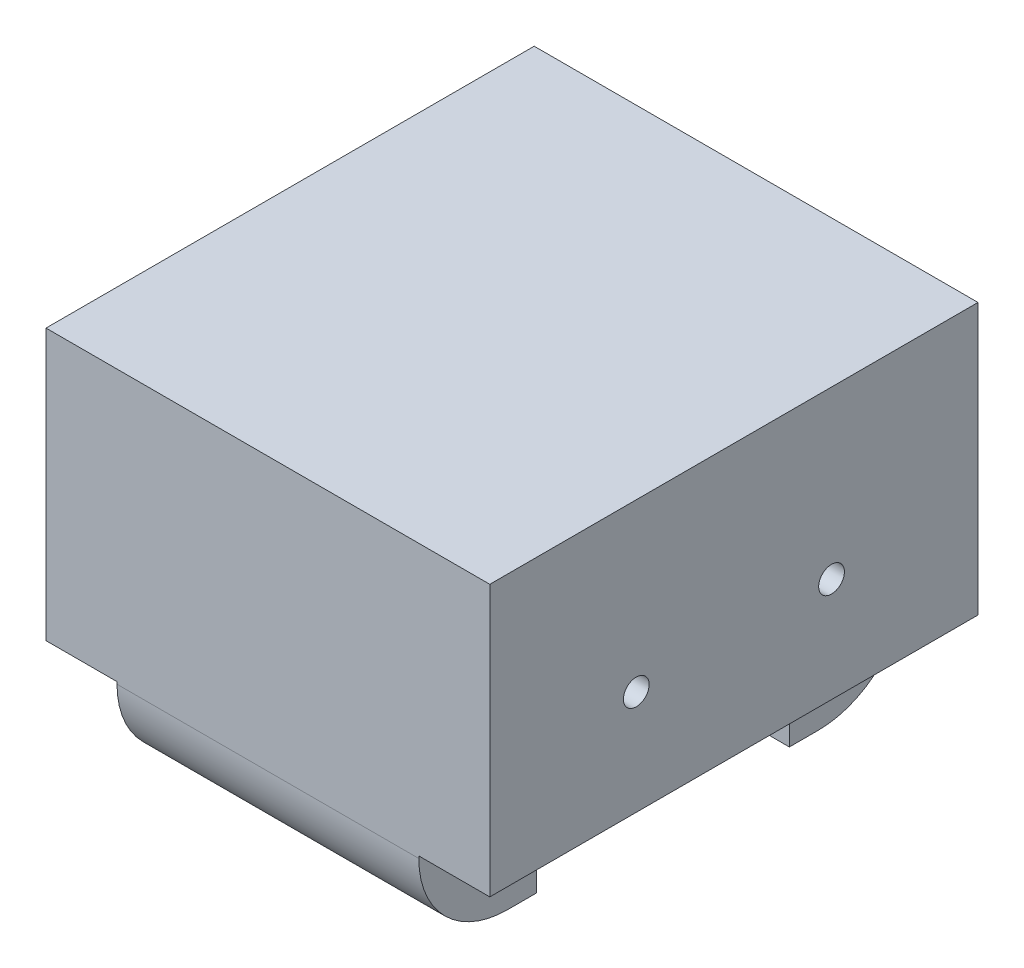
ISO-10303-21;
HEADER;
FILE_DESCRIPTION(('STEP AP214'),'2;1');
FILE_NAME('part.step','',(''),(''),'','','');
FILE_SCHEMA(('AUTOMOTIVE_DESIGN { 1 0 10303 214 1 1 1 1 }'));
ENDSEC;
DATA;
#1=APPLICATION_CONTEXT('core data for automotive mechanical design processes');
#2=APPLICATION_PROTOCOL_DEFINITION('international standard','automotive_design',2000,#1);
#3=PRODUCT_CONTEXT('',#1,'mechanical');
#4=PRODUCT('Part','Part','',(#3));
#5=PRODUCT_RELATED_PRODUCT_CATEGORY('part','',(#4));
#6=PRODUCT_DEFINITION_FORMATION('','',#4);
#7=PRODUCT_DEFINITION_CONTEXT('part definition',#1,'design');
#8=PRODUCT_DEFINITION('design','',#6,#7);
#9=PRODUCT_DEFINITION_SHAPE('','',#8);
#10=(LENGTH_UNIT() NAMED_UNIT(*) SI_UNIT(.MILLI.,.METRE.));
#11=(NAMED_UNIT(*) PLANE_ANGLE_UNIT() SI_UNIT($,.RADIAN.));
#12=(NAMED_UNIT(*) SI_UNIT($,.STERADIAN.) SOLID_ANGLE_UNIT());
#13=UNCERTAINTY_MEASURE_WITH_UNIT(LENGTH_MEASURE(1.E-05),#10,'distance_accuracy_value','');
#14=(GEOMETRIC_REPRESENTATION_CONTEXT(3) GLOBAL_UNCERTAINTY_ASSIGNED_CONTEXT((#13)) GLOBAL_UNIT_ASSIGNED_CONTEXT((#10,
#11,#12)) REPRESENTATION_CONTEXT('',''));
#15=CARTESIAN_POINT('',(0.,0.,0.));
#16=DIRECTION('',(0.,0.,1.));
#17=DIRECTION('',(1.,0.,0.));
#18=AXIS2_PLACEMENT_3D('',#15,#16,#17);
#19=CARTESIAN_POINT('',(0.,0.,-55.));
#20=DIRECTION('',(0.,0.,1.));
#21=DIRECTION('',(1.,0.,0.));
#22=AXIS2_PLACEMENT_3D('',#19,#20,#21);
#23=PLANE('',#22);
#24=DIRECTION('',(0.,-1.,0.));
#25=VECTOR('',#24,1.);
#26=CARTESIAN_POINT('',(-25.,0.,-55.));
#27=LINE('',#26,#25);
#28=CARTESIAN_POINT('',(-25.,-117.,-55.));
#29=VERTEX_POINT('',#28);
#30=CARTESIAN_POINT('',(-25.0000000000001,-147.5,-55.));
#31=VERTEX_POINT('',#30);
#32=EDGE_CURVE('E243',#29,#31,#27,.T.);
#33=ORIENTED_EDGE('',*,*,#32,.F.);
#34=DIRECTION('',(1.,0.,0.));
#35=VECTOR('',#34,1.);
#36=CARTESIAN_POINT('',(0.,-117.,-55.));
#37=LINE('',#36,#35);
#38=CARTESIAN_POINT('',(25.,-117.,-55.));
#39=VERTEX_POINT('',#38);
#40=EDGE_CURVE('E265',#29,#39,#37,.T.);
#41=ORIENTED_EDGE('',*,*,#40,.T.);
#42=DIRECTION('',(0.,1.,0.));
#43=VECTOR('',#42,1.);
#44=CARTESIAN_POINT('',(25.,0.,-55.));
#45=LINE('',#44,#43);
#46=CARTESIAN_POINT('',(25.,-147.5,-55.));
#47=VERTEX_POINT('',#46);
#48=EDGE_CURVE('E49',#47,#39,#45,.T.);
#49=ORIENTED_EDGE('',*,*,#48,.F.);
#50=DIRECTION('',(1.,0.,0.));
#51=VECTOR('',#50,1.);
#52=CARTESIAN_POINT('',(-25.0000000000001,-147.5,-55.));
#53=LINE('',#52,#51);
#54=CARTESIAN_POINT('',(17.,-147.5,-55.));
#55=VERTEX_POINT('',#54);
#56=EDGE_CURVE('E232',#55,#47,#53,.T.);
#57=ORIENTED_EDGE('',*,*,#56,.F.);
#58=DIRECTION('',(0.,-1.,0.));
#59=VECTOR('',#58,1.);
#60=CARTESIAN_POINT('',(17.,0.,-55.));
#61=LINE('',#60,#59);
#62=CARTESIAN_POINT('',(17.,-147.75,-55.));
#63=VERTEX_POINT('',#62);
#64=EDGE_CURVE('E182',#55,#63,#61,.T.);
#65=ORIENTED_EDGE('',*,*,#64,.T.);
#66=DIRECTION('',(1.,0.,0.));
#67=VECTOR('',#66,1.);
#68=CARTESIAN_POINT('',(0.,-147.75,-55.));
#69=LINE('',#68,#67);
#70=CARTESIAN_POINT('',(-17.,-147.75,-55.));
#71=VERTEX_POINT('',#70);
#72=EDGE_CURVE('E176',#63,#71,#69,.F.);
#73=ORIENTED_EDGE('',*,*,#72,.T.);
#74=DIRECTION('',(0.,1.,0.));
#75=VECTOR('',#74,1.);
#76=CARTESIAN_POINT('',(-17.,0.,-55.));
#77=LINE('',#76,#75);
#78=CARTESIAN_POINT('',(-17.,-147.5,-55.));
#79=VERTEX_POINT('',#78);
#80=EDGE_CURVE('E179',#71,#79,#77,.T.);
#81=ORIENTED_EDGE('',*,*,#80,.T.);
#82=EDGE_CURVE('E230',#31,#79,#53,.T.);
#83=ORIENTED_EDGE('',*,*,#82,.F.);
#84=EDGE_LOOP('',(#33,#41,#49,#57,#65,#73,#81,#83));
#85=FACE_BOUND('',#84,.T.);
#86=ADVANCED_FACE('F46',(#85),#23,.F.);
#87=CARTESIAN_POINT('',(0.,0.,0.));
#88=DIRECTION('',(0.,0.,1.));
#89=DIRECTION('',(1.,0.,0.));
#90=AXIS2_PLACEMENT_3D('',#87,#88,#89);
#91=PLANE('',#90);
#92=DIRECTION('',(-1.,0.,0.));
#93=VECTOR('',#92,1.);
#94=CARTESIAN_POINT('',(25.,-117.,0.));
#95=LINE('',#94,#93);
#96=CARTESIAN_POINT('',(25.,-117.,0.));
#97=VERTEX_POINT('',#96);
#98=CARTESIAN_POINT('',(-25.,-117.,0.));
#99=VERTEX_POINT('',#98);
#100=EDGE_CURVE('E71',#97,#99,#95,.T.);
#101=ORIENTED_EDGE('',*,*,#100,.T.);
#102=DIRECTION('',(0.,-1.,0.));
#103=VECTOR('',#102,1.);
#104=CARTESIAN_POINT('',(-25.,0.,0.));
#105=LINE('',#104,#103);
#106=CARTESIAN_POINT('',(-25.0000000000001,-147.5,0.));
#107=VERTEX_POINT('',#106);
#108=EDGE_CURVE('E235',#99,#107,#105,.T.);
#109=ORIENTED_EDGE('',*,*,#108,.T.);
#110=DIRECTION('',(1.,0.,0.));
#111=VECTOR('',#110,1.);
#112=CARTESIAN_POINT('',(-25.0000000000001,-147.5,0.));
#113=LINE('',#112,#111);
#114=CARTESIAN_POINT('',(-17.,-147.5,0.));
#115=VERTEX_POINT('',#114);
#116=EDGE_CURVE('E218',#107,#115,#113,.T.);
#117=ORIENTED_EDGE('',*,*,#116,.T.);
#118=DIRECTION('',(0.,1.,0.));
#119=VECTOR('',#118,1.);
#120=CARTESIAN_POINT('',(-17.,0.,0.));
#121=LINE('',#120,#119);
#122=CARTESIAN_POINT('',(-17.,-147.75,0.));
#123=VERTEX_POINT('',#122);
#124=EDGE_CURVE('E204',#123,#115,#121,.T.);
#125=ORIENTED_EDGE('',*,*,#124,.F.);
#126=DIRECTION('',(1.,0.,0.));
#127=VECTOR('',#126,1.);
#128=CARTESIAN_POINT('',(0.,-147.75,0.));
#129=LINE('',#128,#127);
#130=CARTESIAN_POINT('',(17.,-147.75,0.));
#131=VERTEX_POINT('',#130);
#132=EDGE_CURVE('E214',#123,#131,#129,.T.);
#133=ORIENTED_EDGE('',*,*,#132,.T.);
#134=DIRECTION('',(0.,-1.,0.));
#135=VECTOR('',#134,1.);
#136=CARTESIAN_POINT('',(17.,0.,0.));
#137=LINE('',#136,#135);
#138=CARTESIAN_POINT('',(17.,-147.5,0.));
#139=VERTEX_POINT('',#138);
#140=EDGE_CURVE('E213',#139,#131,#137,.T.);
#141=ORIENTED_EDGE('',*,*,#140,.F.);
#142=CARTESIAN_POINT('',(25.,-147.5,0.));
#143=VERTEX_POINT('',#142);
#144=EDGE_CURVE('E217',#139,#143,#113,.T.);
#145=ORIENTED_EDGE('',*,*,#144,.T.);
#146=DIRECTION('',(0.,1.,0.));
#147=VECTOR('',#146,1.);
#148=CARTESIAN_POINT('',(25.,0.,0.));
#149=LINE('',#148,#147);
#150=EDGE_CURVE('E295',#143,#97,#149,.T.);
#151=ORIENTED_EDGE('',*,*,#150,.T.);
#152=EDGE_LOOP('',(#101,#109,#117,#125,#133,#141,#145,#151));
#153=FACE_BOUND('',#152,.T.);
#154=ADVANCED_FACE('F301',(#153),#91,.T.);
#155=CARTESIAN_POINT('',(-25.,0.,-55.));
#156=DIRECTION('',(-1.,0.,0.));
#157=DIRECTION('',(0.,-1.,0.));
#158=AXIS2_PLACEMENT_3D('',#155,#156,#157);
#159=PLANE('',#158);
#160=DIRECTION('',(0.,0.,1.));
#161=VECTOR('',#160,1.);
#162=CARTESIAN_POINT('',(-25.,-117.,0.));
#163=LINE('',#162,#161);
#164=EDGE_CURVE('E11',#29,#99,#163,.T.);
#165=ORIENTED_EDGE('',*,*,#164,.F.);
#166=ORIENTED_EDGE('',*,*,#32,.T.);
#167=DIRECTION('',(0.,0.,1.));
#168=VECTOR('',#167,1.);
#169=CARTESIAN_POINT('',(-25.0000000000001,-147.5,0.));
#170=LINE('',#169,#168);
#171=EDGE_CURVE('E239',#31,#107,#170,.T.);
#172=ORIENTED_EDGE('',*,*,#171,.T.);
#173=ORIENTED_EDGE('',*,*,#108,.F.);
#174=EDGE_LOOP('',(#165,#166,#172,#173));
#175=FACE_BOUND('',#174,.T.);
#176=CARTESIAN_POINT('',(-25.,-135.75,-16.5));
#177=DIRECTION('',(-1.,0.,0.));
#178=DIRECTION('',(0.,-1.,0.));
#179=AXIS2_PLACEMENT_3D('',#176,#177,#178);
#180=CIRCLE('',#179,1.45);
#181=CARTESIAN_POINT('',(-25.,-137.2,-16.5));
#182=VERTEX_POINT('',#181);
#183=EDGE_CURVE('E274',#182,#182,#180,.T.);
#184=ORIENTED_EDGE('',*,*,#183,.F.);
#185=EDGE_LOOP('',(#184));
#186=FACE_BOUND('',#185,.T.);
#187=CARTESIAN_POINT('',(-25.,-135.75,-38.5));
#188=DIRECTION('',(-1.,0.,0.));
#189=DIRECTION('',(0.,-1.,0.));
#190=AXIS2_PLACEMENT_3D('',#187,#188,#189);
#191=CIRCLE('',#190,1.45);
#192=CARTESIAN_POINT('',(-25.,-137.2,-38.5));
#193=VERTEX_POINT('',#192);
#194=EDGE_CURVE('E267',#193,#193,#191,.T.);
#195=ORIENTED_EDGE('',*,*,#194,.F.);
#196=EDGE_LOOP('',(#195));
#197=FACE_BOUND('',#196,.T.);
#198=ADVANCED_FACE('F314',(#175,#186,#197),#159,.T.);
#199=CARTESIAN_POINT('',(25.,0.,-55.));
#200=DIRECTION('',(1.,0.,0.));
#201=DIRECTION('',(0.,1.,0.));
#202=AXIS2_PLACEMENT_3D('',#199,#200,#201);
#203=PLANE('',#202);
#204=DIRECTION('',(0.,0.,1.));
#205=VECTOR('',#204,1.);
#206=CARTESIAN_POINT('',(25.,-117.,0.));
#207=LINE('',#206,#205);
#208=EDGE_CURVE('E242',#39,#97,#207,.T.);
#209=ORIENTED_EDGE('',*,*,#208,.T.);
#210=ORIENTED_EDGE('',*,*,#150,.F.);
#211=DIRECTION('',(0.,0.,1.));
#212=VECTOR('',#211,1.);
#213=CARTESIAN_POINT('',(25.,-147.5,0.));
#214=LINE('',#213,#212);
#215=EDGE_CURVE('E236',#47,#143,#214,.T.);
#216=ORIENTED_EDGE('',*,*,#215,.F.);
#217=ORIENTED_EDGE('',*,*,#48,.T.);
#218=EDGE_LOOP('',(#209,#210,#216,#217));
#219=FACE_BOUND('',#218,.T.);
#220=CARTESIAN_POINT('',(25.,-135.75,-16.5));
#221=DIRECTION('',(-1.,0.,0.));
#222=DIRECTION('',(0.,-1.,0.));
#223=AXIS2_PLACEMENT_3D('',#220,#221,#222);
#224=CIRCLE('',#223,1.45);
#225=CARTESIAN_POINT('',(25.,-137.2,-16.5));
#226=VERTEX_POINT('',#225);
#227=EDGE_CURVE('E285',#226,#226,#224,.T.);
#228=ORIENTED_EDGE('',*,*,#227,.T.);
#229=EDGE_LOOP('',(#228));
#230=FACE_BOUND('',#229,.T.);
#231=CARTESIAN_POINT('',(25.,-135.75,-38.5));
#232=DIRECTION('',(-1.,0.,0.));
#233=DIRECTION('',(0.,-1.,0.));
#234=AXIS2_PLACEMENT_3D('',#231,#232,#233);
#235=CIRCLE('',#234,1.45);
#236=CARTESIAN_POINT('',(25.,-137.2,-38.5));
#237=VERTEX_POINT('',#236);
#238=EDGE_CURVE('E269',#237,#237,#235,.T.);
#239=ORIENTED_EDGE('',*,*,#238,.T.);
#240=EDGE_LOOP('',(#239));
#241=FACE_BOUND('',#240,.T.);
#242=ADVANCED_FACE('F306',(#219,#230,#241),#203,.T.);
#243=CARTESIAN_POINT('',(-25.0000000000001,-132.5,0.));
#244=DIRECTION('',(0.,1.,0.));
#245=DIRECTION('',(-1.,0.,0.));
#246=AXIS2_PLACEMENT_3D('',#243,#244,#245);
#247=PLANE('',#246);
#248=DIRECTION('',(1.,0.,0.));
#249=VECTOR('',#248,1.);
#250=CARTESIAN_POINT('',(0.,-132.5,-41.75));
#251=LINE('',#250,#249);
#252=CARTESIAN_POINT('',(-17.,-132.5,-41.75));
#253=VERTEX_POINT('',#252);
#254=CARTESIAN_POINT('',(17.,-132.5,-41.75));
#255=VERTEX_POINT('',#254);
#256=EDGE_CURVE('E226',#253,#255,#251,.T.);
#257=ORIENTED_EDGE('',*,*,#256,.T.);
#258=DIRECTION('',(0.,0.,1.));
#259=VECTOR('',#258,1.);
#260=CARTESIAN_POINT('',(17.,-132.5,-55.));
#261=LINE('',#260,#259);
#262=CARTESIAN_POINT('',(17.,-132.5,-13.25));
#263=VERTEX_POINT('',#262);
#264=EDGE_CURVE('E223',#255,#263,#261,.T.);
#265=ORIENTED_EDGE('',*,*,#264,.T.);
#266=DIRECTION('',(1.,0.,0.));
#267=VECTOR('',#266,1.);
#268=CARTESIAN_POINT('',(0.,-132.5,-13.25));
#269=LINE('',#268,#267);
#270=CARTESIAN_POINT('',(-17.,-132.5,-13.25));
#271=VERTEX_POINT('',#270);
#272=EDGE_CURVE('E251',#271,#263,#269,.T.);
#273=ORIENTED_EDGE('',*,*,#272,.F.);
#274=DIRECTION('',(0.,0.,1.));
#275=VECTOR('',#274,1.);
#276=CARTESIAN_POINT('',(-17.,-132.5,-55.));
#277=LINE('',#276,#275);
#278=EDGE_CURVE('E227',#253,#271,#277,.T.);
#279=ORIENTED_EDGE('',*,*,#278,.F.);
#280=EDGE_LOOP('',(#257,#265,#273,#279));
#281=FACE_BOUND('',#280,.T.);
#282=ADVANCED_FACE('F377',(#281),#247,.F.);
#283=CARTESIAN_POINT('',(17.,-167.75,-55.));
#284=DIRECTION('',(1.,0.,0.));
#285=DIRECTION('',(0.,0.,-1.));
#286=AXIS2_PLACEMENT_3D('',#283,#284,#285);
#287=PLANE('',#286);
#288=DIRECTION('',(0.,0.,1.));
#289=VECTOR('',#288,1.);
#290=CARTESIAN_POINT('',(17.,-147.5,-55.));
#291=LINE('',#290,#289);
#292=CARTESIAN_POINT('',(17.,-147.5,-41.75));
#293=VERTEX_POINT('',#292);
#294=CARTESIAN_POINT('',(17.,-147.5,-13.25));
#295=VERTEX_POINT('',#294);
#296=EDGE_CURVE('E225',#293,#295,#291,.T.);
#297=ORIENTED_EDGE('',*,*,#296,.T.);
#298=DIRECTION('',(0.,-1.,0.));
#299=VECTOR('',#298,1.);
#300=CARTESIAN_POINT('',(17.,0.,-13.25));
#301=LINE('',#300,#299);
#302=EDGE_CURVE('E254',#263,#295,#301,.T.);
#303=ORIENTED_EDGE('',*,*,#302,.F.);
#304=ORIENTED_EDGE('',*,*,#264,.F.);
#305=DIRECTION('',(0.,-1.,0.));
#306=VECTOR('',#305,1.);
#307=CARTESIAN_POINT('',(17.,0.,-41.75));
#308=LINE('',#307,#306);
#309=EDGE_CURVE('E196',#255,#293,#308,.T.);
#310=ORIENTED_EDGE('',*,*,#309,.T.);
#311=EDGE_LOOP('',(#297,#303,#304,#310));
#312=FACE_BOUND('',#311,.T.);
#313=CARTESIAN_POINT('',(17.,-135.75,-38.5));
#314=DIRECTION('',(-1.,0.,0.));
#315=DIRECTION('',(0.,-1.,0.));
#316=AXIS2_PLACEMENT_3D('',#313,#314,#315);
#317=CIRCLE('',#316,1.45);
#318=CARTESIAN_POINT('',(17.,-137.2,-38.5));
#319=VERTEX_POINT('',#318);
#320=EDGE_CURVE('E282',#319,#319,#317,.T.);
#321=ORIENTED_EDGE('',*,*,#320,.F.);
#322=EDGE_LOOP('',(#321));
#323=FACE_BOUND('',#322,.T.);
#324=CARTESIAN_POINT('',(17.,-135.75,-16.5));
#325=DIRECTION('',(-1.,0.,0.));
#326=DIRECTION('',(0.,-1.,0.));
#327=AXIS2_PLACEMENT_3D('',#324,#325,#326);
#328=CIRCLE('',#327,1.45);
#329=CARTESIAN_POINT('',(17.,-137.2,-16.5));
#330=VERTEX_POINT('',#329);
#331=EDGE_CURVE('E55',#330,#330,#328,.T.);
#332=ORIENTED_EDGE('',*,*,#331,.F.);
#333=EDGE_LOOP('',(#332));
#334=FACE_BOUND('',#333,.T.);
#335=ADVANCED_FACE('F344',(#312,#323,#334),#287,.F.);
#336=CARTESIAN_POINT('',(-17.,-167.75,-55.));
#337=DIRECTION('',(-1.,0.,0.));
#338=DIRECTION('',(0.,0.,1.));
#339=AXIS2_PLACEMENT_3D('',#336,#337,#338);
#340=PLANE('',#339);
#341=ORIENTED_EDGE('',*,*,#278,.T.);
#342=DIRECTION('',(0.,1.,0.));
#343=VECTOR('',#342,1.);
#344=CARTESIAN_POINT('',(-17.,0.,-13.25));
#345=LINE('',#344,#343);
#346=CARTESIAN_POINT('',(-17.,-147.5,-13.25));
#347=VERTEX_POINT('',#346);
#348=EDGE_CURVE('E255',#347,#271,#345,.T.);
#349=ORIENTED_EDGE('',*,*,#348,.F.);
#350=DIRECTION('',(0.,0.,-1.));
#351=VECTOR('',#350,1.);
#352=CARTESIAN_POINT('',(-17.,-147.5,-55.));
#353=LINE('',#352,#351);
#354=CARTESIAN_POINT('',(-17.,-147.5,-41.75));
#355=VERTEX_POINT('',#354);
#356=EDGE_CURVE('E222',#347,#355,#353,.T.);
#357=ORIENTED_EDGE('',*,*,#356,.T.);
#358=DIRECTION('',(0.,1.,0.));
#359=VECTOR('',#358,1.);
#360=CARTESIAN_POINT('',(-17.,0.,-41.75));
#361=LINE('',#360,#359);
#362=EDGE_CURVE('E193',#355,#253,#361,.T.);
#363=ORIENTED_EDGE('',*,*,#362,.T.);
#364=EDGE_LOOP('',(#341,#349,#357,#363));
#365=FACE_BOUND('',#364,.T.);
#366=CARTESIAN_POINT('',(-17.,-135.75,-38.5));
#367=DIRECTION('',(-1.,0.,0.));
#368=DIRECTION('',(0.,-1.,0.));
#369=AXIS2_PLACEMENT_3D('',#366,#367,#368);
#370=CIRCLE('',#369,1.45);
#371=CARTESIAN_POINT('',(-17.,-137.2,-38.5));
#372=VERTEX_POINT('',#371);
#373=EDGE_CURVE('E275',#372,#372,#370,.T.);
#374=ORIENTED_EDGE('',*,*,#373,.T.);
#375=EDGE_LOOP('',(#374));
#376=FACE_BOUND('',#375,.T.);
#377=CARTESIAN_POINT('',(-17.,-135.75,-16.5));
#378=DIRECTION('',(-1.,0.,0.));
#379=DIRECTION('',(0.,-1.,0.));
#380=AXIS2_PLACEMENT_3D('',#377,#378,#379);
#381=CIRCLE('',#380,1.45);
#382=CARTESIAN_POINT('',(-17.,-137.2,-16.5));
#383=VERTEX_POINT('',#382);
#384=EDGE_CURVE('E238',#383,#383,#381,.T.);
#385=ORIENTED_EDGE('',*,*,#384,.T.);
#386=EDGE_LOOP('',(#385));
#387=FACE_BOUND('',#386,.T.);
#388=ADVANCED_FACE('F519',(#365,#376,#387),#340,.F.);
#389=CARTESIAN_POINT('',(-25.0000000000001,-147.5,0.));
#390=DIRECTION('',(0.,1.,0.));
#391=DIRECTION('',(-1.,0.,0.));
#392=AXIS2_PLACEMENT_3D('',#389,#390,#391);
#393=PLANE('',#392);
#394=ORIENTED_EDGE('',*,*,#215,.T.);
#395=ORIENTED_EDGE('',*,*,#144,.F.);
#396=EDGE_CURVE('E212',#295,#139,#291,.T.);
#397=ORIENTED_EDGE('',*,*,#396,.F.);
#398=ORIENTED_EDGE('',*,*,#296,.F.);
#399=EDGE_CURVE('E194',#55,#293,#291,.T.);
#400=ORIENTED_EDGE('',*,*,#399,.F.);
#401=ORIENTED_EDGE('',*,*,#56,.T.);
#402=EDGE_LOOP('',(#394,#395,#397,#398,#400,#401));
#403=FACE_BOUND('',#402,.T.);
#404=ADVANCED_FACE('F348',(#403),#393,.F.);
#405=ORIENTED_EDGE('',*,*,#82,.T.);
#406=EDGE_CURVE('E186',#355,#79,#353,.T.);
#407=ORIENTED_EDGE('',*,*,#406,.F.);
#408=ORIENTED_EDGE('',*,*,#356,.F.);
#409=EDGE_CURVE('E219',#115,#347,#353,.T.);
#410=ORIENTED_EDGE('',*,*,#409,.F.);
#411=ORIENTED_EDGE('',*,*,#116,.F.);
#412=ORIENTED_EDGE('',*,*,#171,.F.);
#413=EDGE_LOOP('',(#405,#407,#408,#410,#411,#412));
#414=FACE_BOUND('',#413,.T.);
#415=ADVANCED_FACE('F318',(#414),#393,.F.);
#416=CARTESIAN_POINT('',(17.,0.,-13.25));
#417=DIRECTION('',(-1.,0.,0.));
#418=DIRECTION('',(0.,0.,1.));
#419=AXIS2_PLACEMENT_3D('',#416,#417,#418);
#420=PLANE('',#419);
#421=ORIENTED_EDGE('',*,*,#140,.T.);
#422=CARTESIAN_POINT('',(17.,-147.75,-10.));
#423=DIRECTION('',(-1.,0.,0.));
#424=DIRECTION('',(0.,0.,1.));
#425=AXIS2_PLACEMENT_3D('',#422,#423,#424);
#426=CIRCLE('',#425,10.);
#427=CARTESIAN_POINT('',(17.0000000000005,-157.75,-10.));
#428=VERTEX_POINT('',#427);
#429=EDGE_CURVE('E210',#131,#428,#426,.F.);
#430=ORIENTED_EDGE('',*,*,#429,.T.);
#431=DIRECTION('',(0.,0.,1.));
#432=VECTOR('',#431,1.);
#433=CARTESIAN_POINT('',(17.0000000000005,-157.75,-13.25));
#434=LINE('',#433,#432);
#435=CARTESIAN_POINT('',(17.0000000000005,-157.75,-13.25));
#436=VERTEX_POINT('',#435);
#437=EDGE_CURVE('E209',#436,#428,#434,.T.);
#438=ORIENTED_EDGE('',*,*,#437,.F.);
#439=EDGE_CURVE('E257',#295,#436,#301,.T.);
#440=ORIENTED_EDGE('',*,*,#439,.F.);
#441=ORIENTED_EDGE('',*,*,#396,.T.);
#442=EDGE_LOOP('',(#421,#430,#438,#440,#441));
#443=FACE_BOUND('',#442,.T.);
#444=ADVANCED_FACE('F331',(#443),#420,.F.);
#445=CARTESIAN_POINT('',(-17.,0.,-13.25));
#446=DIRECTION('',(1.,0.,0.));
#447=DIRECTION('',(0.,0.,-1.));
#448=AXIS2_PLACEMENT_3D('',#445,#446,#447);
#449=PLANE('',#448);
#450=DIRECTION('',(0.,0.,1.));
#451=VECTOR('',#450,1.);
#452=CARTESIAN_POINT('',(-17.,-157.75,-13.25));
#453=LINE('',#452,#451);
#454=CARTESIAN_POINT('',(-17.,-157.75,-13.25));
#455=VERTEX_POINT('',#454);
#456=CARTESIAN_POINT('',(-17.,-157.75,-10.));
#457=VERTEX_POINT('',#456);
#458=EDGE_CURVE('E205',#455,#457,#453,.T.);
#459=ORIENTED_EDGE('',*,*,#458,.T.);
#460=CARTESIAN_POINT('',(-17.,-147.75,-10.));
#461=DIRECTION('',(1.,0.,0.));
#462=DIRECTION('',(0.,0.,-1.));
#463=AXIS2_PLACEMENT_3D('',#460,#461,#462);
#464=CIRCLE('',#463,10.);
#465=EDGE_CURVE('E202',#457,#123,#464,.F.);
#466=ORIENTED_EDGE('',*,*,#465,.T.);
#467=ORIENTED_EDGE('',*,*,#124,.T.);
#468=ORIENTED_EDGE('',*,*,#409,.T.);
#469=EDGE_CURVE('E260',#455,#347,#345,.T.);
#470=ORIENTED_EDGE('',*,*,#469,.F.);
#471=EDGE_LOOP('',(#459,#466,#467,#468,#470));
#472=FACE_BOUND('',#471,.T.);
#473=ADVANCED_FACE('F485',(#472),#449,.F.);
#474=CARTESIAN_POINT('',(0.,-157.75,-13.25));
#475=DIRECTION('',(0.,-1.,0.));
#476=DIRECTION('',(0.,0.,-1.));
#477=AXIS2_PLACEMENT_3D('',#474,#475,#476);
#478=PLANE('',#477);
#479=ORIENTED_EDGE('',*,*,#437,.T.);
#480=DIRECTION('',(1.,0.,0.));
#481=VECTOR('',#480,1.);
#482=CARTESIAN_POINT('',(0.,-157.75,-10.));
#483=LINE('',#482,#481);
#484=EDGE_CURVE('E206',#428,#457,#483,.F.);
#485=ORIENTED_EDGE('',*,*,#484,.T.);
#486=ORIENTED_EDGE('',*,*,#458,.F.);
#487=DIRECTION('',(1.,0.,0.));
#488=VECTOR('',#487,1.);
#489=CARTESIAN_POINT('',(0.,-157.75,-13.25));
#490=LINE('',#489,#488);
#491=EDGE_CURVE('E208',#455,#436,#490,.T.);
#492=ORIENTED_EDGE('',*,*,#491,.T.);
#493=EDGE_LOOP('',(#479,#485,#486,#492));
#494=FACE_BOUND('',#493,.T.);
#495=ADVANCED_FACE('F334',(#494),#478,.T.);
#496=CARTESIAN_POINT('',(0.,0.,-13.25));
#497=DIRECTION('',(0.,0.,1.));
#498=DIRECTION('',(1.,0.,0.));
#499=AXIS2_PLACEMENT_3D('',#496,#497,#498);
#500=PLANE('',#499);
#501=ORIENTED_EDGE('',*,*,#469,.T.);
#502=ORIENTED_EDGE('',*,*,#348,.T.);
#503=ORIENTED_EDGE('',*,*,#272,.T.);
#504=ORIENTED_EDGE('',*,*,#302,.T.);
#505=ORIENTED_EDGE('',*,*,#439,.T.);
#506=ORIENTED_EDGE('',*,*,#491,.F.);
#507=EDGE_LOOP('',(#501,#502,#503,#504,#505,#506));
#508=FACE_BOUND('',#507,.T.);
#509=ADVANCED_FACE('F338',(#508),#500,.F.);
#510=CARTESIAN_POINT('',(17.,0.,-41.75));
#511=DIRECTION('',(1.,0.,0.));
#512=DIRECTION('',(0.,0.,-1.));
#513=AXIS2_PLACEMENT_3D('',#510,#511,#512);
#514=PLANE('',#513);
#515=DIRECTION('',(0.,0.,-1.));
#516=VECTOR('',#515,1.);
#517=CARTESIAN_POINT('',(17.0000000000005,-157.75,-41.75));
#518=LINE('',#517,#516);
#519=CARTESIAN_POINT('',(17.0000000000005,-157.75,-41.75));
#520=VERTEX_POINT('',#519);
#521=CARTESIAN_POINT('',(17.0000000000005,-157.75,-45.));
#522=VERTEX_POINT('',#521);
#523=EDGE_CURVE('E199',#520,#522,#518,.T.);
#524=ORIENTED_EDGE('',*,*,#523,.T.);
#525=CARTESIAN_POINT('',(17.,-147.75,-45.));
#526=DIRECTION('',(1.,0.,0.));
#527=DIRECTION('',(0.,0.,-1.));
#528=AXIS2_PLACEMENT_3D('',#525,#526,#527);
#529=CIRCLE('',#528,10.);
#530=EDGE_CURVE('E81',#522,#63,#529,.T.);
#531=ORIENTED_EDGE('',*,*,#530,.T.);
#532=ORIENTED_EDGE('',*,*,#64,.F.);
#533=ORIENTED_EDGE('',*,*,#399,.T.);
#534=EDGE_CURVE('E169',#293,#520,#308,.T.);
#535=ORIENTED_EDGE('',*,*,#534,.T.);
#536=EDGE_LOOP('',(#524,#531,#532,#533,#535));
#537=FACE_BOUND('',#536,.T.);
#538=ADVANCED_FACE('F349',(#537),#514,.T.);
#539=CARTESIAN_POINT('',(-17.,0.,-41.75));
#540=DIRECTION('',(-1.,0.,0.));
#541=DIRECTION('',(0.,0.,1.));
#542=AXIS2_PLACEMENT_3D('',#539,#540,#541);
#543=PLANE('',#542);
#544=ORIENTED_EDGE('',*,*,#80,.F.);
#545=CARTESIAN_POINT('',(-17.,-147.75,-45.));
#546=DIRECTION('',(-1.,0.,0.));
#547=DIRECTION('',(0.,0.,1.));
#548=AXIS2_PLACEMENT_3D('',#545,#546,#547);
#549=CIRCLE('',#548,10.);
#550=CARTESIAN_POINT('',(-17.,-157.75,-45.));
#551=VERTEX_POINT('',#550);
#552=EDGE_CURVE('E163',#71,#551,#549,.T.);
#553=ORIENTED_EDGE('',*,*,#552,.T.);
#554=DIRECTION('',(0.,0.,-1.));
#555=VECTOR('',#554,1.);
#556=CARTESIAN_POINT('',(-17.,-157.75,-41.75));
#557=LINE('',#556,#555);
#558=CARTESIAN_POINT('',(-17.,-157.75,-41.75));
#559=VERTEX_POINT('',#558);
#560=EDGE_CURVE('E159',#559,#551,#557,.T.);
#561=ORIENTED_EDGE('',*,*,#560,.F.);
#562=EDGE_CURVE('E190',#559,#355,#361,.T.);
#563=ORIENTED_EDGE('',*,*,#562,.T.);
#564=ORIENTED_EDGE('',*,*,#406,.T.);
#565=EDGE_LOOP('',(#544,#553,#561,#563,#564));
#566=FACE_BOUND('',#565,.T.);
#567=ADVANCED_FACE('F185',(#566),#543,.T.);
#568=CARTESIAN_POINT('',(0.,-157.75,-41.75));
#569=DIRECTION('',(0.,1.,0.));
#570=DIRECTION('',(0.,0.,1.));
#571=AXIS2_PLACEMENT_3D('',#568,#569,#570);
#572=PLANE('',#571);
#573=ORIENTED_EDGE('',*,*,#560,.T.);
#574=DIRECTION('',(1.,0.,0.));
#575=VECTOR('',#574,1.);
#576=CARTESIAN_POINT('',(0.,-157.75,-45.));
#577=LINE('',#576,#575);
#578=EDGE_CURVE('E189',#551,#522,#577,.T.);
#579=ORIENTED_EDGE('',*,*,#578,.T.);
#580=ORIENTED_EDGE('',*,*,#523,.F.);
#581=DIRECTION('',(1.,0.,0.));
#582=VECTOR('',#581,1.);
#583=CARTESIAN_POINT('',(0.,-157.75,-41.75));
#584=LINE('',#583,#582);
#585=EDGE_CURVE('E201',#559,#520,#584,.T.);
#586=ORIENTED_EDGE('',*,*,#585,.F.);
#587=EDGE_LOOP('',(#573,#579,#580,#586));
#588=FACE_BOUND('',#587,.T.);
#589=ADVANCED_FACE('F357',(#588),#572,.F.);
#590=CARTESIAN_POINT('',(0.,0.,-41.75));
#591=DIRECTION('',(0.,0.,-1.));
#592=DIRECTION('',(1.,0.,0.));
#593=AXIS2_PLACEMENT_3D('',#590,#591,#592);
#594=PLANE('',#593);
#595=ORIENTED_EDGE('',*,*,#562,.F.);
#596=ORIENTED_EDGE('',*,*,#585,.T.);
#597=ORIENTED_EDGE('',*,*,#534,.F.);
#598=ORIENTED_EDGE('',*,*,#309,.F.);
#599=ORIENTED_EDGE('',*,*,#256,.F.);
#600=ORIENTED_EDGE('',*,*,#362,.F.);
#601=EDGE_LOOP('',(#595,#596,#597,#598,#599,#600));
#602=FACE_BOUND('',#601,.T.);
#603=ADVANCED_FACE('F352',(#602),#594,.F.);
#604=CARTESIAN_POINT('',(0.,-117.,0.));
#605=DIRECTION('',(0.,1.,0.));
#606=DIRECTION('',(0.,0.,1.));
#607=AXIS2_PLACEMENT_3D('',#604,#605,#606);
#608=PLANE('',#607);
#609=ORIENTED_EDGE('',*,*,#40,.F.);
#610=ORIENTED_EDGE('',*,*,#164,.T.);
#611=ORIENTED_EDGE('',*,*,#100,.F.);
#612=ORIENTED_EDGE('',*,*,#208,.F.);
#613=EDGE_LOOP('',(#609,#610,#611,#612));
#614=FACE_BOUND('',#613,.T.);
#615=ADVANCED_FACE('F311',(#614),#608,.T.);
#616=CARTESIAN_POINT('',(-17.,-135.75,-38.5));
#617=DIRECTION('',(-1.,0.,0.));
#618=DIRECTION('',(0.,-1.,0.));
#619=AXIS2_PLACEMENT_3D('',#616,#617,#618);
#620=CYLINDRICAL_SURFACE('',#619,1.45);
#621=ORIENTED_EDGE('',*,*,#373,.F.);
#622=EDGE_LOOP('',(#621));
#623=FACE_BOUND('',#622,.T.);
#624=ORIENTED_EDGE('',*,*,#194,.T.);
#625=EDGE_LOOP('',(#624));
#626=FACE_BOUND('',#625,.T.);
#627=ADVANCED_FACE('F390',(#623,#626),#620,.F.);
#628=CARTESIAN_POINT('',(-17.,-135.75,-16.5));
#629=DIRECTION('',(-1.,0.,0.));
#630=DIRECTION('',(0.,-1.,0.));
#631=AXIS2_PLACEMENT_3D('',#628,#629,#630);
#632=CYLINDRICAL_SURFACE('',#631,1.45);
#633=ORIENTED_EDGE('',*,*,#384,.F.);
#634=EDGE_LOOP('',(#633));
#635=FACE_BOUND('',#634,.T.);
#636=ORIENTED_EDGE('',*,*,#183,.T.);
#637=EDGE_LOOP('',(#636));
#638=FACE_BOUND('',#637,.T.);
#639=ADVANCED_FACE('F386',(#635,#638),#632,.F.);
#640=CARTESIAN_POINT('',(17.,-135.75,-38.5));
#641=DIRECTION('',(1.,0.,0.));
#642=DIRECTION('',(0.,1.,0.));
#643=AXIS2_PLACEMENT_3D('',#640,#641,#642);
#644=CYLINDRICAL_SURFACE('',#643,1.45);
#645=ORIENTED_EDGE('',*,*,#320,.T.);
#646=EDGE_LOOP('',(#645));
#647=FACE_BOUND('',#646,.T.);
#648=ORIENTED_EDGE('',*,*,#238,.F.);
#649=EDGE_LOOP('',(#648));
#650=FACE_BOUND('',#649,.T.);
#651=ADVANCED_FACE('F382',(#647,#650),#644,.F.);
#652=CARTESIAN_POINT('',(17.,-135.75,-16.5));
#653=DIRECTION('',(1.,0.,0.));
#654=DIRECTION('',(0.,1.,0.));
#655=AXIS2_PLACEMENT_3D('',#652,#653,#654);
#656=CYLINDRICAL_SURFACE('',#655,1.45);
#657=ORIENTED_EDGE('',*,*,#331,.T.);
#658=EDGE_LOOP('',(#657));
#659=FACE_BOUND('',#658,.T.);
#660=ORIENTED_EDGE('',*,*,#227,.F.);
#661=EDGE_LOOP('',(#660));
#662=FACE_BOUND('',#661,.T.);
#663=ADVANCED_FACE('F379',(#659,#662),#656,.F.);
#664=CARTESIAN_POINT('',(0.,-147.75,-10.));
#665=DIRECTION('',(1.,0.,0.));
#666=DIRECTION('',(0.,0.,-1.));
#667=AXIS2_PLACEMENT_3D('',#664,#665,#666);
#668=CYLINDRICAL_SURFACE('',#667,10.);
#669=ORIENTED_EDGE('',*,*,#465,.F.);
#670=ORIENTED_EDGE('',*,*,#484,.F.);
#671=ORIENTED_EDGE('',*,*,#429,.F.);
#672=ORIENTED_EDGE('',*,*,#132,.F.);
#673=EDGE_LOOP('',(#669,#670,#671,#672));
#674=FACE_BOUND('',#673,.T.);
#675=ADVANCED_FACE('F327',(#674),#668,.T.);
#676=CARTESIAN_POINT('',(0.,-147.75,-45.));
#677=DIRECTION('',(1.,0.,0.));
#678=DIRECTION('',(0.,0.,-1.));
#679=AXIS2_PLACEMENT_3D('',#676,#677,#678);
#680=CYLINDRICAL_SURFACE('',#679,10.);
#681=ORIENTED_EDGE('',*,*,#552,.F.);
#682=ORIENTED_EDGE('',*,*,#72,.F.);
#683=ORIENTED_EDGE('',*,*,#530,.F.);
#684=ORIENTED_EDGE('',*,*,#578,.F.);
#685=EDGE_LOOP('',(#681,#682,#683,#684));
#686=FACE_BOUND('',#685,.T.);
#687=ADVANCED_FACE('F188',(#686),#680,.T.);
#688=CLOSED_SHELL('',(#86,#154,#198,#242,#282,#335,#388,#404,#415,#444,#473,#495,#509,#538,#567,
#589,#603,#615,#627,#639,#651,#663,#675,#687));
#689=MANIFOLD_SOLID_BREP('B2',#688);
#690=ADVANCED_BREP_SHAPE_REPRESENTATION('',(#18,#689),#14);
#691=SHAPE_DEFINITION_REPRESENTATION(#9,#690);
ENDSEC;
END-ISO-10303-21;
